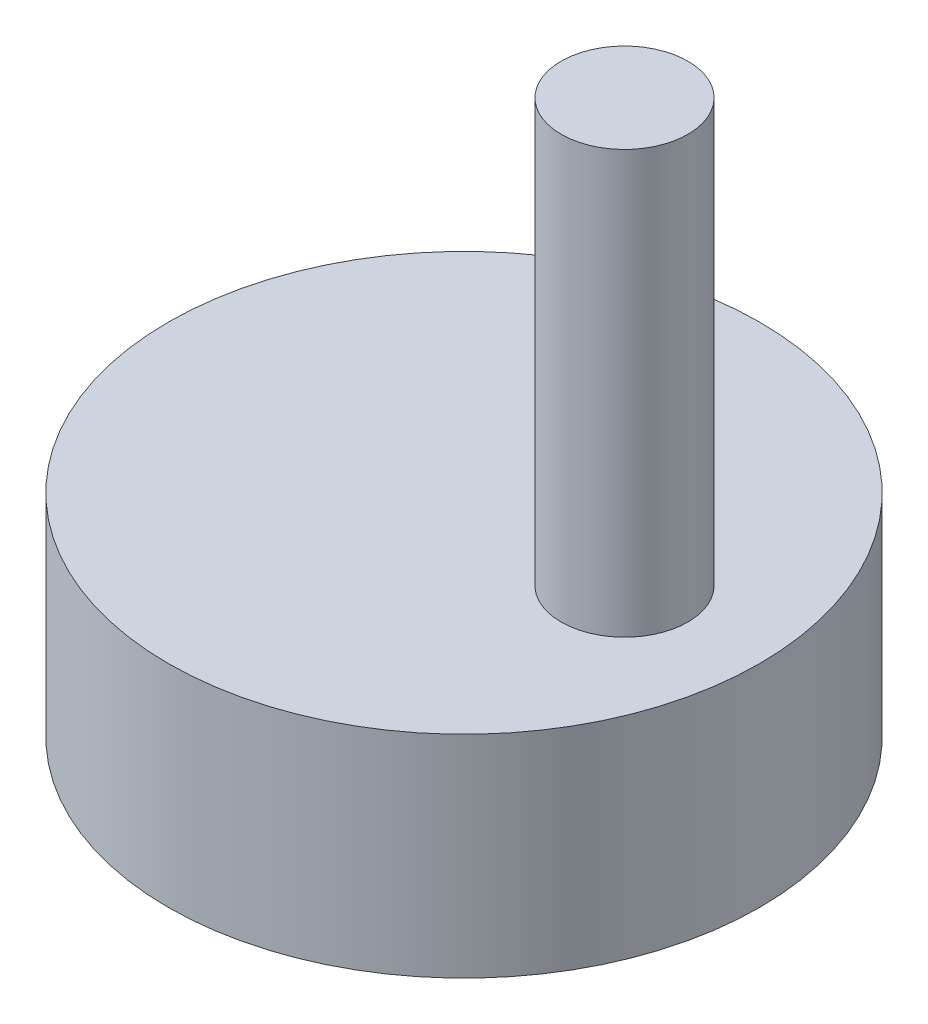
ISO-10303-21;
HEADER;
FILE_DESCRIPTION(('STEP AP214'),'2;1');
FILE_NAME('part.step','',(''),(''),'','','');
FILE_SCHEMA(('AUTOMOTIVE_DESIGN { 1 0 10303 214 1 1 1 1 }'));
ENDSEC;
DATA;
#1=APPLICATION_CONTEXT('core data for automotive mechanical design processes');
#2=APPLICATION_PROTOCOL_DEFINITION('international standard','automotive_design',2000,#1);
#3=PRODUCT_CONTEXT('',#1,'mechanical');
#4=PRODUCT('Part','Part','',(#3));
#5=PRODUCT_RELATED_PRODUCT_CATEGORY('part','',(#4));
#6=PRODUCT_DEFINITION_FORMATION('','',#4);
#7=PRODUCT_DEFINITION_CONTEXT('part definition',#1,'design');
#8=PRODUCT_DEFINITION('design','',#6,#7);
#9=PRODUCT_DEFINITION_SHAPE('','',#8);
#10=(LENGTH_UNIT() NAMED_UNIT(*) SI_UNIT(.MILLI.,.METRE.));
#11=(NAMED_UNIT(*) PLANE_ANGLE_UNIT() SI_UNIT($,.RADIAN.));
#12=(NAMED_UNIT(*) SI_UNIT($,.STERADIAN.) SOLID_ANGLE_UNIT());
#13=UNCERTAINTY_MEASURE_WITH_UNIT(LENGTH_MEASURE(1.E-05),#10,'distance_accuracy_value','');
#14=(GEOMETRIC_REPRESENTATION_CONTEXT(3) GLOBAL_UNCERTAINTY_ASSIGNED_CONTEXT((#13)) GLOBAL_UNIT_ASSIGNED_CONTEXT((#10,
#11,#12)) REPRESENTATION_CONTEXT('',''));
#15=CARTESIAN_POINT('',(0.,0.,0.));
#16=DIRECTION('',(0.,0.,1.));
#17=DIRECTION('',(1.,0.,0.));
#18=AXIS2_PLACEMENT_3D('',#15,#16,#17);
#19=CARTESIAN_POINT('',(0.,50.,0.));
#20=DIRECTION('',(0.,-1.,0.));
#21=DIRECTION('',(0.,0.,-1.));
#22=AXIS2_PLACEMENT_3D('',#19,#20,#21);
#23=CYLINDRICAL_SURFACE('',#22,70.);
#24=CARTESIAN_POINT('',(0.,50.,0.));
#25=DIRECTION('',(0.,1.,0.));
#26=DIRECTION('',(0.,0.,1.));
#27=AXIS2_PLACEMENT_3D('',#24,#25,#26);
#28=CIRCLE('',#27,70.);
#29=CARTESIAN_POINT('',(0.,50.,70.));
#30=VERTEX_POINT('',#29);
#31=EDGE_CURVE('E10',#30,#30,#28,.T.);
#32=ORIENTED_EDGE('',*,*,#31,.F.);
#33=EDGE_LOOP('',(#32));
#34=FACE_BOUND('',#33,.T.);
#35=CARTESIAN_POINT('',(0.,0.,0.));
#36=DIRECTION('',(0.,1.,0.));
#37=DIRECTION('',(0.,0.,1.));
#38=AXIS2_PLACEMENT_3D('',#35,#36,#37);
#39=CIRCLE('',#38,70.);
#40=CARTESIAN_POINT('',(0.,0.,70.));
#41=VERTEX_POINT('',#40);
#42=EDGE_CURVE('E38',#41,#41,#39,.T.);
#43=ORIENTED_EDGE('',*,*,#42,.T.);
#44=EDGE_LOOP('',(#43));
#45=FACE_BOUND('',#44,.T.);
#46=ADVANCED_FACE('F35',(#34,#45),#23,.T.);
#47=CARTESIAN_POINT('',(0.,50.,0.));
#48=DIRECTION('',(0.,1.,0.));
#49=DIRECTION('',(0.,0.,1.));
#50=AXIS2_PLACEMENT_3D('',#47,#48,#49);
#51=PLANE('',#50);
#52=CARTESIAN_POINT('',(38.,50.,0.));
#53=DIRECTION('',(0.,1.,0.));
#54=DIRECTION('',(0.,0.,1.));
#55=AXIS2_PLACEMENT_3D('',#52,#53,#54);
#56=CIRCLE('',#55,15.);
#57=CARTESIAN_POINT('',(38.,50.,15.));
#58=VERTEX_POINT('',#57);
#59=EDGE_CURVE('E47',#58,#58,#56,.T.);
#60=ORIENTED_EDGE('',*,*,#59,.F.);
#61=EDGE_LOOP('',(#60));
#62=FACE_BOUND('',#61,.T.);
#63=ORIENTED_EDGE('',*,*,#31,.T.);
#64=EDGE_LOOP('',(#63));
#65=FACE_BOUND('',#64,.T.);
#66=ADVANCED_FACE('F62',(#62,#65),#51,.T.);
#67=CARTESIAN_POINT('',(0.,0.,0.));
#68=DIRECTION('',(0.,1.,0.));
#69=DIRECTION('',(0.,0.,1.));
#70=AXIS2_PLACEMENT_3D('',#67,#68,#69);
#71=PLANE('',#70);
#72=ORIENTED_EDGE('',*,*,#42,.F.);
#73=EDGE_LOOP('',(#72));
#74=FACE_BOUND('',#73,.T.);
#75=ADVANCED_FACE('F58',(#74),#71,.F.);
#76=CARTESIAN_POINT('',(38.,150.,0.));
#77=DIRECTION('',(0.,-1.,0.));
#78=DIRECTION('',(0.,0.,-1.));
#79=AXIS2_PLACEMENT_3D('',#76,#77,#78);
#80=CYLINDRICAL_SURFACE('',#79,15.);
#81=CARTESIAN_POINT('',(38.,150.,0.));
#82=DIRECTION('',(0.,1.,0.));
#83=DIRECTION('',(0.,0.,1.));
#84=AXIS2_PLACEMENT_3D('',#81,#82,#83);
#85=CIRCLE('',#84,15.);
#86=CARTESIAN_POINT('',(38.,150.,15.));
#87=VERTEX_POINT('',#86);
#88=EDGE_CURVE('E45',#87,#87,#85,.T.);
#89=ORIENTED_EDGE('',*,*,#88,.F.);
#90=EDGE_LOOP('',(#89));
#91=FACE_BOUND('',#90,.T.);
#92=ORIENTED_EDGE('',*,*,#59,.T.);
#93=EDGE_LOOP('',(#92));
#94=FACE_BOUND('',#93,.T.);
#95=ADVANCED_FACE('F55',(#91,#94),#80,.T.);
#96=CARTESIAN_POINT('',(38.,150.,0.));
#97=DIRECTION('',(0.,1.,0.));
#98=DIRECTION('',(0.,0.,1.));
#99=AXIS2_PLACEMENT_3D('',#96,#97,#98);
#100=PLANE('',#99);
#101=ORIENTED_EDGE('',*,*,#88,.T.);
#102=EDGE_LOOP('',(#101));
#103=FACE_BOUND('',#102,.T.);
#104=ADVANCED_FACE('F53',(#103),#100,.T.);
#105=CLOSED_SHELL('',(#46,#66,#75,#95,#104));
#106=MANIFOLD_SOLID_BREP('B2',#105);
#107=ADVANCED_BREP_SHAPE_REPRESENTATION('',(#18,#106),#14);
#108=SHAPE_DEFINITION_REPRESENTATION(#9,#107);
ENDSEC;
END-ISO-10303-21;
